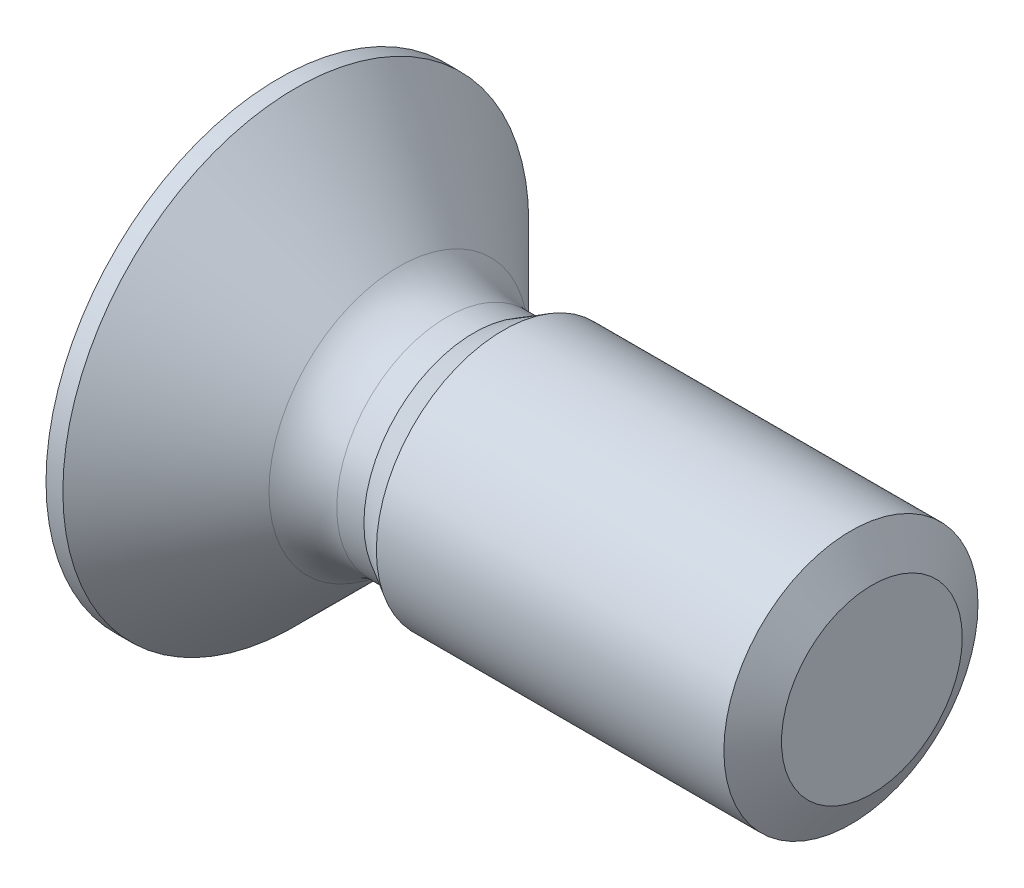
ISO-10303-21;
HEADER;
FILE_DESCRIPTION(('STEP AP214'),'2;1');
FILE_NAME('part.step','',(''),(''),'','','');
FILE_SCHEMA(('AUTOMOTIVE_DESIGN { 1 0 10303 214 1 1 1 1 }'));
ENDSEC;
DATA;
#1=APPLICATION_CONTEXT('core data for automotive mechanical design processes');
#2=APPLICATION_PROTOCOL_DEFINITION('international standard','automotive_design',2000,#1);
#3=PRODUCT_CONTEXT('',#1,'mechanical');
#4=PRODUCT('Part','Part','',(#3));
#5=PRODUCT_RELATED_PRODUCT_CATEGORY('part','',(#4));
#6=PRODUCT_DEFINITION_FORMATION('','',#4);
#7=PRODUCT_DEFINITION_CONTEXT('part definition',#1,'design');
#8=PRODUCT_DEFINITION('design','',#6,#7);
#9=PRODUCT_DEFINITION_SHAPE('','',#8);
#10=(LENGTH_UNIT() NAMED_UNIT(*) SI_UNIT(.MILLI.,.METRE.));
#11=(NAMED_UNIT(*) PLANE_ANGLE_UNIT() SI_UNIT($,.RADIAN.));
#12=(NAMED_UNIT(*) SI_UNIT($,.STERADIAN.) SOLID_ANGLE_UNIT());
#13=UNCERTAINTY_MEASURE_WITH_UNIT(LENGTH_MEASURE(1.E-05),#10,'distance_accuracy_value','');
#14=(GEOMETRIC_REPRESENTATION_CONTEXT(3) GLOBAL_UNCERTAINTY_ASSIGNED_CONTEXT((#13)) GLOBAL_UNIT_ASSIGNED_CONTEXT((#10,
#11,#12)) REPRESENTATION_CONTEXT('',''));
#15=CARTESIAN_POINT('',(0.,0.,0.));
#16=DIRECTION('',(0.,0.,1.));
#17=DIRECTION('',(1.,0.,0.));
#18=AXIS2_PLACEMENT_3D('',#15,#16,#17);
#19=CARTESIAN_POINT('',(0.,0.,0.));
#20=DIRECTION('',(1.,0.,0.));
#21=DIRECTION('',(0.,0.,-1.));
#22=AXIS2_PLACEMENT_3D('',#19,#20,#21);
#23=PLANE('',#22);
#24=CARTESIAN_POINT('',(0.,0.,0.));
#25=DIRECTION('',(-1.,0.,0.));
#26=DIRECTION('',(0.,0.,1.));
#27=AXIS2_PLACEMENT_3D('',#24,#25,#26);
#28=CIRCLE('',#27,2.75);
#29=CARTESIAN_POINT('',(0.,0.,2.75));
#30=VERTEX_POINT('',#29);
#31=EDGE_CURVE('E182',#30,#30,#28,.T.);
#32=ORIENTED_EDGE('',*,*,#31,.T.);
#33=EDGE_LOOP('',(#32));
#34=FACE_BOUND('',#33,.T.);
#35=DIRECTION('',(0.,1.,0.));
#36=VECTOR('',#35,1.);
#37=CARTESIAN_POINT('',(0.,1.6,0.250000000000006));
#38=LINE('',#37,#36);
#39=CARTESIAN_POINT('',(0.,0.25,0.250000000000001));
#40=VERTEX_POINT('',#39);
#41=CARTESIAN_POINT('',(0.,1.6,0.250000000000006));
#42=VERTEX_POINT('',#41);
#43=EDGE_CURVE('E104',#40,#42,#38,.T.);
#44=ORIENTED_EDGE('',*,*,#43,.F.);
#45=DIRECTION('',(0.,0.,-1.));
#46=VECTOR('',#45,1.);
#47=CARTESIAN_POINT('',(0.,0.25,-1.6));
#48=LINE('',#47,#46);
#49=CARTESIAN_POINT('',(0.,0.25,1.6));
#50=VERTEX_POINT('',#49);
#51=EDGE_CURVE('E149',#50,#40,#48,.T.);
#52=ORIENTED_EDGE('',*,*,#51,.F.);
#53=DIRECTION('',(0.,1.,0.));
#54=VECTOR('',#53,1.);
#55=CARTESIAN_POINT('',(0.,0.25,1.6));
#56=LINE('',#55,#54);
#57=CARTESIAN_POINT('',(0.,-0.25,1.6));
#58=VERTEX_POINT('',#57);
#59=EDGE_CURVE('E146',#58,#50,#56,.T.);
#60=ORIENTED_EDGE('',*,*,#59,.F.);
#61=DIRECTION('',(0.,0.,1.));
#62=VECTOR('',#61,1.);
#63=CARTESIAN_POINT('',(0.,-0.25,-1.6));
#64=LINE('',#63,#62);
#65=CARTESIAN_POINT('',(0.,-0.25,0.249999999999999));
#66=VERTEX_POINT('',#65);
#67=EDGE_CURVE('E77',#66,#58,#64,.T.);
#68=ORIENTED_EDGE('',*,*,#67,.F.);
#69=CARTESIAN_POINT('',(0.,-1.6,0.249999999999994));
#70=VERTEX_POINT('',#69);
#71=EDGE_CURVE('E112',#70,#66,#38,.T.);
#72=ORIENTED_EDGE('',*,*,#71,.F.);
#73=DIRECTION('',(0.,0.,1.));
#74=VECTOR('',#73,1.);
#75=CARTESIAN_POINT('',(0.,-1.6,0.249999999999994));
#76=LINE('',#75,#74);
#77=CARTESIAN_POINT('',(0.,-1.6,-0.250000000000006));
#78=VERTEX_POINT('',#77);
#79=EDGE_CURVE('E113',#78,#70,#76,.T.);
#80=ORIENTED_EDGE('',*,*,#79,.F.);
#81=DIRECTION('',(0.,-1.,0.));
#82=VECTOR('',#81,1.);
#83=CARTESIAN_POINT('',(0.,1.6,-0.249999999999994));
#84=LINE('',#83,#82);
#85=CARTESIAN_POINT('',(0.,-0.25,-0.250000000000001));
#86=VERTEX_POINT('',#85);
#87=EDGE_CURVE('E126',#86,#78,#84,.T.);
#88=ORIENTED_EDGE('',*,*,#87,.F.);
#89=CARTESIAN_POINT('',(0.,-0.25,-1.6));
#90=VERTEX_POINT('',#89);
#91=EDGE_CURVE('E143',#90,#86,#64,.T.);
#92=ORIENTED_EDGE('',*,*,#91,.F.);
#93=DIRECTION('',(0.,-1.,0.));
#94=VECTOR('',#93,1.);
#95=CARTESIAN_POINT('',(0.,0.25,-1.6));
#96=LINE('',#95,#94);
#97=CARTESIAN_POINT('',(0.,0.25,-1.6));
#98=VERTEX_POINT('',#97);
#99=EDGE_CURVE('E54',#98,#90,#96,.T.);
#100=ORIENTED_EDGE('',*,*,#99,.F.);
#101=CARTESIAN_POINT('',(0.,0.25,-0.249999999999999));
#102=VERTEX_POINT('',#101);
#103=EDGE_CURVE('E152',#102,#98,#48,.T.);
#104=ORIENTED_EDGE('',*,*,#103,.F.);
#105=CARTESIAN_POINT('',(0.,1.6,-0.249999999999994));
#106=VERTEX_POINT('',#105);
#107=EDGE_CURVE('E125',#106,#102,#84,.T.);
#108=ORIENTED_EDGE('',*,*,#107,.F.);
#109=DIRECTION('',(0.,0.,-1.));
#110=VECTOR('',#109,1.);
#111=CARTESIAN_POINT('',(0.,1.6,0.250000000000006));
#112=LINE('',#111,#110);
#113=EDGE_CURVE('E118',#42,#106,#112,.T.);
#114=ORIENTED_EDGE('',*,*,#113,.F.);
#115=EDGE_LOOP('',(#44,#52,#60,#68,#72,#80,#88,#92,#100,#104,#108,#114));
#116=FACE_BOUND('',#115,.T.);
#117=ADVANCED_FACE('F40',(#34,#116),#23,.F.);
#118=CARTESIAN_POINT('',(2.1,0.,0.));
#119=DIRECTION('',(-0.118212889785112,-0.992988274194944,0.));
#120=DIRECTION('',(0.992988274194944,-0.118212889785112,0.));
#121=AXIS2_PLACEMENT_3D('',#118,#119,#120);
#122=PLANE('',#121);
#123=ORIENTED_EDGE('',*,*,#51,.T.);
#124=DIRECTION('',(0.986122002690152,-0.117395476510732,-0.117395476510733));
#125=VECTOR('',#124,1.);
#126=CARTESIAN_POINT('',(2.1,0.,0.));
#127=LINE('',#126,#125);
#128=CARTESIAN_POINT('',(2.1,0.,0.));
#129=VERTEX_POINT('',#128);
#130=EDGE_CURVE('E83',#40,#129,#127,.T.);
#131=ORIENTED_EDGE('',*,*,#130,.T.);
#132=DIRECTION('',(0.791889207905293,-0.0942725247506301,-0.603344158404032));
#133=VECTOR('',#132,1.);
#134=CARTESIAN_POINT('',(0.,0.25,1.6));
#135=LINE('',#134,#133);
#136=EDGE_CURVE('E63',#50,#129,#135,.T.);
#137=ORIENTED_EDGE('',*,*,#136,.F.);
#138=EDGE_LOOP('',(#123,#131,#137));
#139=FACE_BOUND('',#138,.T.);
#140=ADVANCED_FACE('F198',(#139),#122,.T.);
#141=DIRECTION('',(0.791889207905293,-0.0942725247506301,0.603344158404032));
#142=VECTOR('',#141,1.);
#143=CARTESIAN_POINT('',(0.,0.25,-1.6));
#144=LINE('',#143,#142);
#145=EDGE_CURVE('E148',#98,#129,#144,.T.);
#146=ORIENTED_EDGE('',*,*,#145,.T.);
#147=DIRECTION('',(-0.986122002690152,0.117395476510732,-0.117395476510732));
#148=VECTOR('',#147,1.);
#149=CARTESIAN_POINT('',(2.1,0.,0.));
#150=LINE('',#149,#148);
#151=EDGE_CURVE('E130',#129,#102,#150,.T.);
#152=ORIENTED_EDGE('',*,*,#151,.T.);
#153=ORIENTED_EDGE('',*,*,#103,.T.);
#154=EDGE_LOOP('',(#146,#152,#153));
#155=FACE_BOUND('',#154,.T.);
#156=ADVANCED_FACE('F192',(#155),#122,.T.);
#157=CARTESIAN_POINT('',(2.1,0.,0.));
#158=DIRECTION('',(-0.118212889785112,0.992988274194944,0.));
#159=DIRECTION('',(-0.992988274194944,-0.118212889785112,0.));
#160=AXIS2_PLACEMENT_3D('',#157,#158,#159);
#161=PLANE('',#160);
#162=DIRECTION('',(0.791889207905293,0.0942725247506301,-0.603344158404032));
#163=VECTOR('',#162,1.);
#164=CARTESIAN_POINT('',(0.,-0.25,1.6));
#165=LINE('',#164,#163);
#166=EDGE_CURVE('E142',#58,#129,#165,.T.);
#167=ORIENTED_EDGE('',*,*,#166,.T.);
#168=DIRECTION('',(-0.986122002690152,-0.117395476510732,0.117395476510732));
#169=VECTOR('',#168,1.);
#170=CARTESIAN_POINT('',(2.1,0.,0.));
#171=LINE('',#170,#169);
#172=EDGE_CURVE('E11',#129,#66,#171,.T.);
#173=ORIENTED_EDGE('',*,*,#172,.T.);
#174=ORIENTED_EDGE('',*,*,#67,.T.);
#175=EDGE_LOOP('',(#167,#173,#174));
#176=FACE_BOUND('',#175,.T.);
#177=ADVANCED_FACE('F193',(#176),#161,.T.);
#178=ORIENTED_EDGE('',*,*,#91,.T.);
#179=DIRECTION('',(0.986122002690152,0.117395476510732,0.117395476510733));
#180=VECTOR('',#179,1.);
#181=CARTESIAN_POINT('',(2.1,0.,0.));
#182=LINE('',#181,#180);
#183=EDGE_CURVE('E47',#86,#129,#182,.T.);
#184=ORIENTED_EDGE('',*,*,#183,.T.);
#185=DIRECTION('',(0.791889207905293,0.0942725247506301,0.603344158404032));
#186=VECTOR('',#185,1.);
#187=CARTESIAN_POINT('',(0.,-0.25,-1.6));
#188=LINE('',#187,#186);
#189=EDGE_CURVE('E157',#90,#129,#188,.T.);
#190=ORIENTED_EDGE('',*,*,#189,.F.);
#191=EDGE_LOOP('',(#178,#184,#190));
#192=FACE_BOUND('',#191,.T.);
#193=ADVANCED_FACE('F186',(#192),#161,.T.);
#194=CARTESIAN_POINT('',(0.,0.,0.));
#195=DIRECTION('',(-1.,0.,0.));
#196=DIRECTION('',(0.,0.,1.));
#197=AXIS2_PLACEMENT_3D('',#194,#195,#196);
#198=CYLINDRICAL_SURFACE('',#197,2.75);
#199=ORIENTED_EDGE('',*,*,#31,.F.);
#200=EDGE_LOOP('',(#199));
#201=FACE_BOUND('',#200,.T.);
#202=CARTESIAN_POINT('',(0.199000000000005,0.,0.));
#203=DIRECTION('',(-1.,0.,0.));
#204=DIRECTION('',(0.,0.,1.));
#205=AXIS2_PLACEMENT_3D('',#202,#203,#204);
#206=CIRCLE('',#205,2.75);
#207=CARTESIAN_POINT('',(0.199000000000005,0.,2.75));
#208=VERTEX_POINT('',#207);
#209=EDGE_CURVE('E178',#208,#208,#206,.T.);
#210=ORIENTED_EDGE('',*,*,#209,.T.);
#211=EDGE_LOOP('',(#210));
#212=FACE_BOUND('',#211,.T.);
#213=ADVANCED_FACE('F226',(#201,#212),#198,.T.);
#214=CARTESIAN_POINT('',(1.41568542494924,0.,0.));
#215=DIRECTION('',(-1.,0.,0.));
#216=DIRECTION('',(0.,0.,1.));
#217=AXIS2_PLACEMENT_3D('',#214,#215,#216);
#218=CONICAL_SURFACE('',#217,1.53331457505076,0.78539816339745);
#219=ORIENTED_EDGE('',*,*,#209,.F.);
#220=EDGE_LOOP('',(#219));
#221=FACE_BOUND('',#220,.T.);
#222=CARTESIAN_POINT('',(1.41568542494924,0.,0.));
#223=DIRECTION('',(-1.,0.,0.));
#224=DIRECTION('',(0.,0.,1.));
#225=AXIS2_PLACEMENT_3D('',#222,#223,#224);
#226=CIRCLE('',#225,1.53331457505076);
#227=CARTESIAN_POINT('',(1.41568542494924,0.,1.53331457505076));
#228=VERTEX_POINT('',#227);
#229=EDGE_CURVE('E174',#228,#228,#226,.T.);
#230=ORIENTED_EDGE('',*,*,#229,.T.);
#231=EDGE_LOOP('',(#230));
#232=FACE_BOUND('',#231,.T.);
#233=ADVANCED_FACE('F229',(#221,#232),#218,.T.);
#234=CARTESIAN_POINT('',(1.98137084989848,0.,0.));
#235=DIRECTION('',(-1.,0.,0.));
#236=DIRECTION('',(0.,0.,1.));
#237=AXIS2_PLACEMENT_3D('',#234,#235,#236);
#238=TOROIDAL_SURFACE('',#237,2.099,0.8);
#239=ORIENTED_EDGE('',*,*,#229,.F.);
#240=EDGE_LOOP('',(#239));
#241=FACE_BOUND('',#240,.T.);
#242=CARTESIAN_POINT('',(1.98137084989848,0.,0.));
#243=DIRECTION('',(-1.,0.,0.));
#244=DIRECTION('',(0.,0.,1.));
#245=AXIS2_PLACEMENT_3D('',#242,#243,#244);
#246=CIRCLE('',#245,1.299);
#247=CARTESIAN_POINT('',(1.98137084989848,0.,1.299));
#248=VERTEX_POINT('',#247);
#249=EDGE_CURVE('E171',#248,#248,#246,.T.);
#250=ORIENTED_EDGE('',*,*,#249,.T.);
#251=EDGE_LOOP('',(#250));
#252=FACE_BOUND('',#251,.T.);
#253=ADVANCED_FACE('F234',(#241,#252),#238,.F.);
#254=CARTESIAN_POINT('',(0.,0.,0.));
#255=DIRECTION('',(-1.,0.,0.));
#256=DIRECTION('',(0.,0.,1.));
#257=AXIS2_PLACEMENT_3D('',#254,#255,#256);
#258=CYLINDRICAL_SURFACE('',#257,1.299);
#259=ORIENTED_EDGE('',*,*,#249,.F.);
#260=EDGE_LOOP('',(#259));
#261=FACE_BOUND('',#260,.T.);
#262=CARTESIAN_POINT('',(2.30185778767866,0.,0.));
#263=DIRECTION('',(-1.,0.,0.));
#264=DIRECTION('',(0.,0.,1.));
#265=AXIS2_PLACEMENT_3D('',#262,#263,#264);
#266=CIRCLE('',#265,1.299);
#267=CARTESIAN_POINT('',(2.30185778767866,0.,1.299));
#268=VERTEX_POINT('',#267);
#269=EDGE_CURVE('E168',#268,#268,#266,.T.);
#270=ORIENTED_EDGE('',*,*,#269,.T.);
#271=EDGE_LOOP('',(#270));
#272=FACE_BOUND('',#271,.T.);
#273=ADVANCED_FACE('F240',(#261,#272),#258,.T.);
#274=CARTESIAN_POINT('',(2.65,0.,0.));
#275=DIRECTION('',(1.,0.,0.));
#276=DIRECTION('',(0.,0.,-1.));
#277=AXIS2_PLACEMENT_3D('',#274,#275,#276);
#278=CONICAL_SURFACE('',#277,1.5,0.5235987755983);
#279=ORIENTED_EDGE('',*,*,#269,.F.);
#280=EDGE_LOOP('',(#279));
#281=FACE_BOUND('',#280,.T.);
#282=CARTESIAN_POINT('',(2.65,0.,0.));
#283=DIRECTION('',(-1.,0.,0.));
#284=DIRECTION('',(0.,0.,1.));
#285=AXIS2_PLACEMENT_3D('',#282,#283,#284);
#286=CIRCLE('',#285,1.5);
#287=CARTESIAN_POINT('',(2.65,0.,1.5));
#288=VERTEX_POINT('',#287);
#289=EDGE_CURVE('E165',#288,#288,#286,.T.);
#290=ORIENTED_EDGE('',*,*,#289,.T.);
#291=EDGE_LOOP('',(#290));
#292=FACE_BOUND('',#291,.T.);
#293=ADVANCED_FACE('F246',(#281,#292),#278,.T.);
#294=CARTESIAN_POINT('',(0.,0.,0.));
#295=DIRECTION('',(-1.,0.,0.));
#296=DIRECTION('',(0.,0.,1.));
#297=AXIS2_PLACEMENT_3D('',#294,#295,#296);
#298=CYLINDRICAL_SURFACE('',#297,1.5);
#299=CARTESIAN_POINT('',(6.75270800287124,0.,0.));
#300=DIRECTION('',(1.,0.,0.));
#301=DIRECTION('',(0.,0.,-1.));
#302=AXIS2_PLACEMENT_3D('',#299,#300,#301);
#303=CIRCLE('',#302,1.5);
#304=CARTESIAN_POINT('',(6.75270800287124,0.,-1.5));
#305=VERTEX_POINT('',#304);
#306=EDGE_CURVE('E162',#305,#305,#303,.T.);
#307=ORIENTED_EDGE('',*,*,#306,.F.);
#308=EDGE_LOOP('',(#307));
#309=FACE_BOUND('',#308,.T.);
#310=ORIENTED_EDGE('',*,*,#289,.F.);
#311=EDGE_LOOP('',(#310));
#312=FACE_BOUND('',#311,.T.);
#313=ADVANCED_FACE('F252',(#309,#312),#298,.T.);
#314=CARTESIAN_POINT('',(6.75270800287124,0.,0.));
#315=DIRECTION('',(-1.,0.,0.));
#316=DIRECTION('',(0.,0.,1.));
#317=AXIS2_PLACEMENT_3D('',#314,#315,#316);
#318=CONICAL_SURFACE('',#317,1.5,1.05188801855135);
#319=CARTESIAN_POINT('',(7.,0.,0.));
#320=DIRECTION('',(1.,0.,0.));
#321=DIRECTION('',(0.,0.,-1.));
#322=AXIS2_PLACEMENT_3D('',#319,#320,#321);
#323=CIRCLE('',#322,1.067);
#324=CARTESIAN_POINT('',(7.,0.,-1.067));
#325=VERTEX_POINT('',#324);
#326=EDGE_CURVE('E151',#325,#325,#323,.T.);
#327=ORIENTED_EDGE('',*,*,#326,.F.);
#328=EDGE_LOOP('',(#327));
#329=FACE_BOUND('',#328,.T.);
#330=ORIENTED_EDGE('',*,*,#306,.T.);
#331=EDGE_LOOP('',(#330));
#332=FACE_BOUND('',#331,.T.);
#333=ADVANCED_FACE('F257',(#329,#332),#318,.T.);
#334=CARTESIAN_POINT('',(7.,1.5,0.));
#335=DIRECTION('',(-1.,0.,0.));
#336=DIRECTION('',(0.,0.,1.));
#337=AXIS2_PLACEMENT_3D('',#334,#335,#336);
#338=PLANE('',#337);
#339=ORIENTED_EDGE('',*,*,#326,.T.);
#340=EDGE_LOOP('',(#339));
#341=FACE_BOUND('',#340,.T.);
#342=ADVANCED_FACE('F263',(#341),#338,.F.);
#343=CARTESIAN_POINT('',(0.,0.25,-1.6));
#344=DIRECTION('',(0.606043215262856,0.,-0.795431720032499));
#345=DIRECTION('',(-0.795431720032499,0.,-0.606043215262856));
#346=AXIS2_PLACEMENT_3D('',#343,#344,#345);
#347=PLANE('',#346);
#348=ORIENTED_EDGE('',*,*,#145,.F.);
#349=ORIENTED_EDGE('',*,*,#99,.T.);
#350=ORIENTED_EDGE('',*,*,#189,.T.);
#351=EDGE_LOOP('',(#348,#349,#350));
#352=FACE_BOUND('',#351,.T.);
#353=ADVANCED_FACE('F190',(#352),#347,.F.);
#354=CARTESIAN_POINT('',(0.,-0.25,1.6));
#355=DIRECTION('',(0.606043215262856,0.,0.795431720032499));
#356=DIRECTION('',(0.795431720032499,0.,-0.606043215262856));
#357=AXIS2_PLACEMENT_3D('',#354,#355,#356);
#358=PLANE('',#357);
#359=ORIENTED_EDGE('',*,*,#166,.F.);
#360=ORIENTED_EDGE('',*,*,#59,.T.);
#361=ORIENTED_EDGE('',*,*,#136,.T.);
#362=EDGE_LOOP('',(#359,#360,#361));
#363=FACE_BOUND('',#362,.T.);
#364=ADVANCED_FACE('F197',(#363),#358,.F.);
#365=CARTESIAN_POINT('',(2.1,0.,0.));
#366=DIRECTION('',(-0.118212889785112,0.,-0.992988274194944));
#367=DIRECTION('',(0.992988274194944,0.,-0.118212889785112));
#368=AXIS2_PLACEMENT_3D('',#365,#366,#367);
#369=PLANE('',#368);
#370=DIRECTION('',(0.791889207905293,0.603344158404033,-0.0942725247506279));
#371=VECTOR('',#370,1.);
#372=CARTESIAN_POINT('',(0.,-1.6,0.249999999999994));
#373=LINE('',#372,#371);
#374=EDGE_CURVE('E122',#70,#129,#373,.T.);
#375=ORIENTED_EDGE('',*,*,#374,.F.);
#376=ORIENTED_EDGE('',*,*,#71,.T.);
#377=ORIENTED_EDGE('',*,*,#172,.F.);
#378=EDGE_LOOP('',(#375,#376,#377));
#379=FACE_BOUND('',#378,.T.);
#380=ADVANCED_FACE('F202',(#379),#369,.T.);
#381=CARTESIAN_POINT('',(2.1,0.,0.));
#382=DIRECTION('',(-0.118212889785112,0.,0.992988274194944));
#383=DIRECTION('',(-0.992988274194944,0.,-0.118212889785112));
#384=AXIS2_PLACEMENT_3D('',#381,#382,#383);
#385=PLANE('',#384);
#386=ORIENTED_EDGE('',*,*,#87,.T.);
#387=DIRECTION('',(0.791889207905293,0.603344158404032,0.0942725247506322));
#388=VECTOR('',#387,1.);
#389=CARTESIAN_POINT('',(0.,-1.6,-0.250000000000006));
#390=LINE('',#389,#388);
#391=EDGE_CURVE('E136',#78,#129,#390,.T.);
#392=ORIENTED_EDGE('',*,*,#391,.T.);
#393=ORIENTED_EDGE('',*,*,#183,.F.);
#394=EDGE_LOOP('',(#386,#392,#393));
#395=FACE_BOUND('',#394,.T.);
#396=ADVANCED_FACE('F206',(#395),#385,.T.);
#397=CARTESIAN_POINT('',(0.,-1.6,-0.250000000000006));
#398=DIRECTION('',(0.606043215262856,-0.795431720032499,0.));
#399=DIRECTION('',(0.795431720032499,0.606043215262856,0.));
#400=AXIS2_PLACEMENT_3D('',#397,#398,#399);
#401=PLANE('',#400);
#402=ORIENTED_EDGE('',*,*,#391,.F.);
#403=ORIENTED_EDGE('',*,*,#79,.T.);
#404=ORIENTED_EDGE('',*,*,#374,.T.);
#405=EDGE_LOOP('',(#402,#403,#404));
#406=FACE_BOUND('',#405,.T.);
#407=ADVANCED_FACE('F205',(#406),#401,.F.);
#408=ORIENTED_EDGE('',*,*,#43,.T.);
#409=DIRECTION('',(0.791889207905293,-0.603344158404032,-0.0942725247506322));
#410=VECTOR('',#409,1.);
#411=CARTESIAN_POINT('',(0.,1.6,0.250000000000006));
#412=LINE('',#411,#410);
#413=EDGE_CURVE('E107',#42,#129,#412,.T.);
#414=ORIENTED_EDGE('',*,*,#413,.T.);
#415=ORIENTED_EDGE('',*,*,#130,.F.);
#416=EDGE_LOOP('',(#408,#414,#415));
#417=FACE_BOUND('',#416,.T.);
#418=ADVANCED_FACE('F106',(#417),#369,.T.);
#419=DIRECTION('',(0.791889207905293,-0.603344158404033,0.0942725247506279));
#420=VECTOR('',#419,1.);
#421=CARTESIAN_POINT('',(0.,1.6,-0.249999999999994));
#422=LINE('',#421,#420);
#423=EDGE_CURVE('E120',#106,#129,#422,.T.);
#424=ORIENTED_EDGE('',*,*,#423,.F.);
#425=ORIENTED_EDGE('',*,*,#107,.T.);
#426=ORIENTED_EDGE('',*,*,#151,.F.);
#427=EDGE_LOOP('',(#424,#425,#426));
#428=FACE_BOUND('',#427,.T.);
#429=ADVANCED_FACE('F209',(#428),#385,.T.);
#430=CARTESIAN_POINT('',(0.,1.6,0.250000000000006));
#431=DIRECTION('',(0.606043215262856,0.795431720032499,0.));
#432=DIRECTION('',(-0.795431720032499,0.606043215262856,0.));
#433=AXIS2_PLACEMENT_3D('',#430,#431,#432);
#434=PLANE('',#433);
#435=ORIENTED_EDGE('',*,*,#413,.F.);
#436=ORIENTED_EDGE('',*,*,#113,.T.);
#437=ORIENTED_EDGE('',*,*,#423,.T.);
#438=EDGE_LOOP('',(#435,#436,#437));
#439=FACE_BOUND('',#438,.T.);
#440=ADVANCED_FACE('F117',(#439),#434,.F.);
#441=CLOSED_SHELL('',(#117,#140,#156,#177,#193,#213,#233,#253,#273,#293,#313,#333,#342,#353,
#364,#380,#396,#407,#418,#429,#440));
#442=MANIFOLD_SOLID_BREP('B2',#441);
#443=ADVANCED_BREP_SHAPE_REPRESENTATION('',(#18,#442),#14);
#444=SHAPE_DEFINITION_REPRESENTATION(#9,#443);
ENDSEC;
END-ISO-10303-21;
